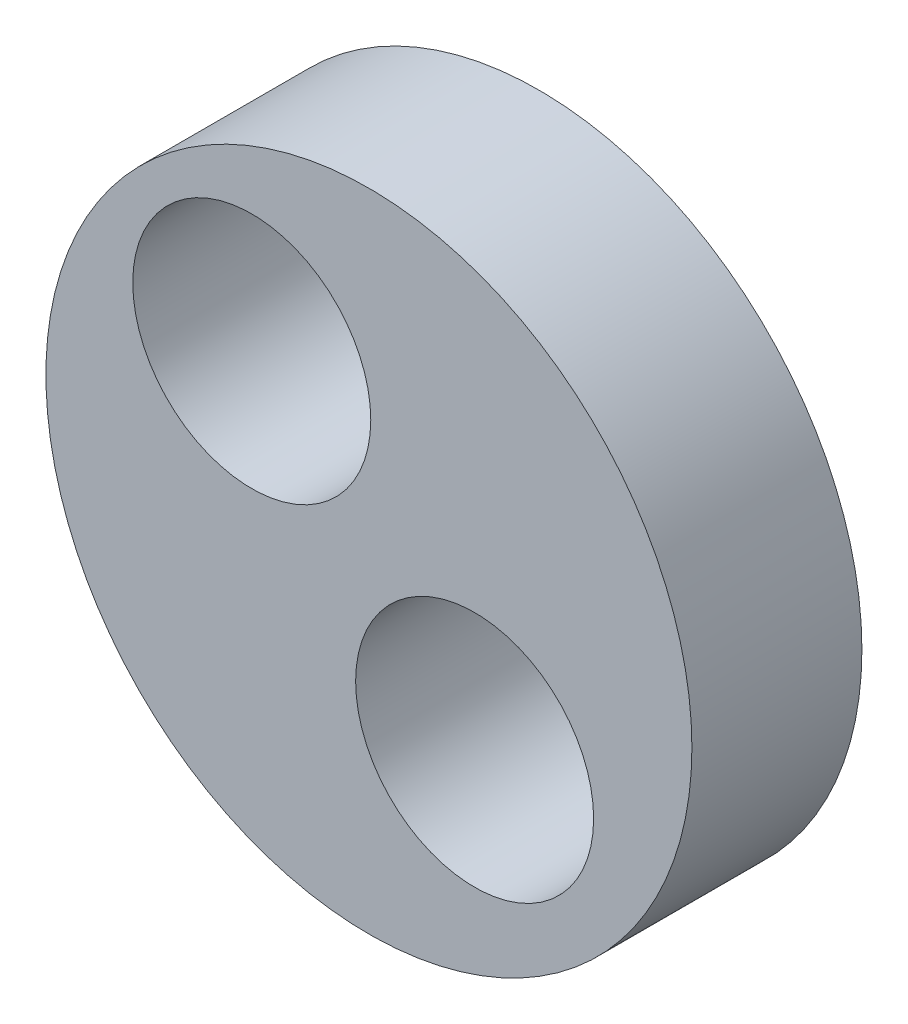
ISO-10303-21;
HEADER;
FILE_DESCRIPTION(('STEP AP214'),'2;1');
FILE_NAME('part.step','',(''),(''),'','','');
FILE_SCHEMA(('AUTOMOTIVE_DESIGN { 1 0 10303 214 1 1 1 1 }'));
ENDSEC;
DATA;
#1=APPLICATION_CONTEXT('core data for automotive mechanical design processes');
#2=APPLICATION_PROTOCOL_DEFINITION('international standard','automotive_design',2000,#1);
#3=PRODUCT_CONTEXT('',#1,'mechanical');
#4=PRODUCT('Part','Part','',(#3));
#5=PRODUCT_RELATED_PRODUCT_CATEGORY('part','',(#4));
#6=PRODUCT_DEFINITION_FORMATION('','',#4);
#7=PRODUCT_DEFINITION_CONTEXT('part definition',#1,'design');
#8=PRODUCT_DEFINITION('design','',#6,#7);
#9=PRODUCT_DEFINITION_SHAPE('','',#8);
#10=(LENGTH_UNIT() NAMED_UNIT(*) SI_UNIT(.MILLI.,.METRE.));
#11=(NAMED_UNIT(*) PLANE_ANGLE_UNIT() SI_UNIT($,.RADIAN.));
#12=(NAMED_UNIT(*) SI_UNIT($,.STERADIAN.) SOLID_ANGLE_UNIT());
#13=UNCERTAINTY_MEASURE_WITH_UNIT(LENGTH_MEASURE(1.E-05),#10,'distance_accuracy_value','');
#14=(GEOMETRIC_REPRESENTATION_CONTEXT(3) GLOBAL_UNCERTAINTY_ASSIGNED_CONTEXT((#13)) GLOBAL_UNIT_ASSIGNED_CONTEXT((#10,
#11,#12)) REPRESENTATION_CONTEXT('',''));
#15=CARTESIAN_POINT('',(0.,0.,0.));
#16=DIRECTION('',(0.,0.,1.));
#17=DIRECTION('',(1.,0.,0.));
#18=AXIS2_PLACEMENT_3D('',#15,#16,#17);
#19=CARTESIAN_POINT('',(0.,0.,6.35));
#20=DIRECTION('',(0.,0.,-1.));
#21=DIRECTION('',(-1.,0.,0.));
#22=AXIS2_PLACEMENT_3D('',#19,#20,#21);
#23=CYLINDRICAL_SURFACE('',#22,12.065);
#24=CARTESIAN_POINT('',(0.,0.,6.35));
#25=DIRECTION('',(0.,0.,1.));
#26=DIRECTION('',(1.,0.,0.));
#27=AXIS2_PLACEMENT_3D('',#24,#25,#26);
#28=CIRCLE('',#27,12.065);
#29=CARTESIAN_POINT('',(12.065,0.,6.35));
#30=VERTEX_POINT('',#29);
#31=EDGE_CURVE('E10',#30,#30,#28,.T.);
#32=ORIENTED_EDGE('',*,*,#31,.F.);
#33=EDGE_LOOP('',(#32));
#34=FACE_BOUND('',#33,.T.);
#35=CARTESIAN_POINT('',(0.,0.,0.));
#36=DIRECTION('',(0.,0.,1.));
#37=DIRECTION('',(1.,0.,0.));
#38=AXIS2_PLACEMENT_3D('',#35,#36,#37);
#39=CIRCLE('',#38,12.065);
#40=CARTESIAN_POINT('',(12.065,0.,0.));
#41=VERTEX_POINT('',#40);
#42=EDGE_CURVE('E33',#41,#41,#39,.T.);
#43=ORIENTED_EDGE('',*,*,#42,.T.);
#44=EDGE_LOOP('',(#43));
#45=FACE_BOUND('',#44,.T.);
#46=ADVANCED_FACE('F27',(#34,#45),#23,.T.);
#47=CARTESIAN_POINT('',(0.,0.,6.35));
#48=DIRECTION('',(0.,0.,1.));
#49=DIRECTION('',(1.,0.,0.));
#50=AXIS2_PLACEMENT_3D('',#47,#48,#49);
#51=PLANE('',#50);
#52=CARTESIAN_POINT('',(3.94919174360837,-4.13099377537844,6.35));
#53=DIRECTION('',(0.,0.,1.));
#54=DIRECTION('',(1.,0.,0.));
#55=AXIS2_PLACEMENT_3D('',#52,#53,#54);
#56=CIRCLE('',#55,4.445);
#57=CARTESIAN_POINT('',(8.39419174360837,-4.13099377537844,6.35));
#58=VERTEX_POINT('',#57);
#59=EDGE_CURVE('E46',#58,#58,#56,.T.);
#60=ORIENTED_EDGE('',*,*,#59,.F.);
#61=EDGE_LOOP('',(#60));
#62=FACE_BOUND('',#61,.T.);
#63=CARTESIAN_POINT('',(-4.37552265564757,4.60188021246912,6.35));
#64=DIRECTION('',(0.,0.,1.));
#65=DIRECTION('',(1.,0.,0.));
#66=AXIS2_PLACEMENT_3D('',#63,#64,#65);
#67=CIRCLE('',#66,4.445);
#68=CARTESIAN_POINT('',(0.0694773443524321,4.60188021246912,6.35));
#69=VERTEX_POINT('',#68);
#70=EDGE_CURVE('E37',#69,#69,#67,.T.);
#71=ORIENTED_EDGE('',*,*,#70,.F.);
#72=EDGE_LOOP('',(#71));
#73=FACE_BOUND('',#72,.T.);
#74=ORIENTED_EDGE('',*,*,#31,.T.);
#75=EDGE_LOOP('',(#74));
#76=FACE_BOUND('',#75,.T.);
#77=ADVANCED_FACE('F59',(#62,#73,#76),#51,.T.);
#78=CARTESIAN_POINT('',(0.,0.,0.));
#79=DIRECTION('',(0.,0.,1.));
#80=DIRECTION('',(1.,0.,0.));
#81=AXIS2_PLACEMENT_3D('',#78,#79,#80);
#82=PLANE('',#81);
#83=CARTESIAN_POINT('',(3.94919174360837,-4.13099377537844,0.));
#84=DIRECTION('',(0.,0.,-1.));
#85=DIRECTION('',(-1.,0.,0.));
#86=AXIS2_PLACEMENT_3D('',#83,#84,#85);
#87=CIRCLE('',#86,4.445);
#88=CARTESIAN_POINT('',(-0.495808256391624,-4.13099377537844,0.));
#89=VERTEX_POINT('',#88);
#90=EDGE_CURVE('E49',#89,#89,#87,.T.);
#91=ORIENTED_EDGE('',*,*,#90,.F.);
#92=EDGE_LOOP('',(#91));
#93=FACE_BOUND('',#92,.T.);
#94=CARTESIAN_POINT('',(-4.37552265564757,4.60188021246912,0.));
#95=DIRECTION('',(0.,0.,-1.));
#96=DIRECTION('',(-1.,0.,0.));
#97=AXIS2_PLACEMENT_3D('',#94,#95,#96);
#98=CIRCLE('',#97,4.445);
#99=CARTESIAN_POINT('',(-8.82052265564757,4.60188021246912,0.));
#100=VERTEX_POINT('',#99);
#101=EDGE_CURVE('E41',#100,#100,#98,.T.);
#102=ORIENTED_EDGE('',*,*,#101,.F.);
#103=EDGE_LOOP('',(#102));
#104=FACE_BOUND('',#103,.T.);
#105=ORIENTED_EDGE('',*,*,#42,.F.);
#106=EDGE_LOOP('',(#105));
#107=FACE_BOUND('',#106,.T.);
#108=ADVANCED_FACE('F55',(#93,#104,#107),#82,.F.);
#109=CARTESIAN_POINT('',(-4.37552265564757,4.60188021246912,25.4));
#110=DIRECTION('',(0.,0.,-1.));
#111=DIRECTION('',(-1.,0.,0.));
#112=AXIS2_PLACEMENT_3D('',#109,#110,#111);
#113=CYLINDRICAL_SURFACE('',#112,4.445);
#114=ORIENTED_EDGE('',*,*,#70,.T.);
#115=EDGE_LOOP('',(#114));
#116=FACE_BOUND('',#115,.T.);
#117=ORIENTED_EDGE('',*,*,#101,.T.);
#118=EDGE_LOOP('',(#117));
#119=FACE_BOUND('',#118,.T.);
#120=ADVANCED_FACE('F58',(#116,#119),#113,.F.);
#121=CARTESIAN_POINT('',(3.94919174360837,-4.13099377537844,25.4));
#122=DIRECTION('',(0.,0.,-1.));
#123=DIRECTION('',(-1.,0.,0.));
#124=AXIS2_PLACEMENT_3D('',#121,#122,#123);
#125=CYLINDRICAL_SURFACE('',#124,4.445);
#126=ORIENTED_EDGE('',*,*,#59,.T.);
#127=EDGE_LOOP('',(#126));
#128=FACE_BOUND('',#127,.T.);
#129=ORIENTED_EDGE('',*,*,#90,.T.);
#130=EDGE_LOOP('',(#129));
#131=FACE_BOUND('',#130,.T.);
#132=ADVANCED_FACE('F53',(#128,#131),#125,.F.);
#133=CLOSED_SHELL('',(#46,#77,#108,#120,#132));
#134=MANIFOLD_SOLID_BREP('B2',#133);
#135=ADVANCED_BREP_SHAPE_REPRESENTATION('',(#18,#134),#14);
#136=SHAPE_DEFINITION_REPRESENTATION(#9,#135);
ENDSEC;
END-ISO-10303-21;
